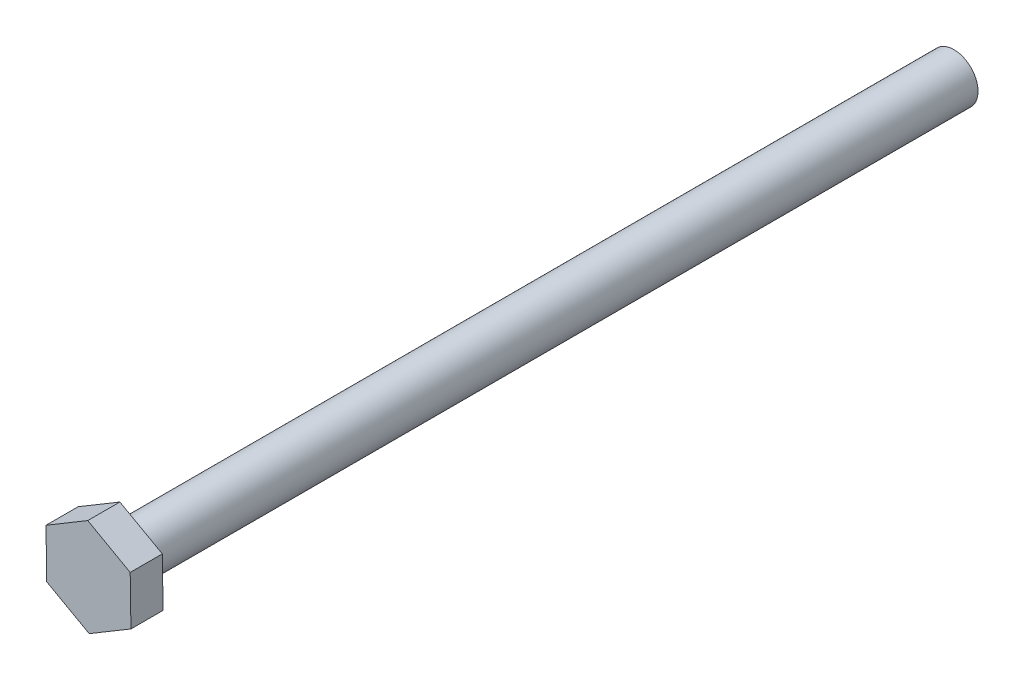
ISO-10303-21;
HEADER;
FILE_DESCRIPTION(('STEP AP214'),'2;1');
FILE_NAME('part.step','',(''),(''),'','','');
FILE_SCHEMA(('AUTOMOTIVE_DESIGN { 1 0 10303 214 1 1 1 1 }'));
ENDSEC;
DATA;
#1=APPLICATION_CONTEXT('core data for automotive mechanical design processes');
#2=APPLICATION_PROTOCOL_DEFINITION('international standard','automotive_design',2000,#1);
#3=PRODUCT_CONTEXT('',#1,'mechanical');
#4=PRODUCT('Part','Part','',(#3));
#5=PRODUCT_RELATED_PRODUCT_CATEGORY('part','',(#4));
#6=PRODUCT_DEFINITION_FORMATION('','',#4);
#7=PRODUCT_DEFINITION_CONTEXT('part definition',#1,'design');
#8=PRODUCT_DEFINITION('design','',#6,#7);
#9=PRODUCT_DEFINITION_SHAPE('','',#8);
#10=(LENGTH_UNIT() NAMED_UNIT(*) SI_UNIT(.MILLI.,.METRE.));
#11=(NAMED_UNIT(*) PLANE_ANGLE_UNIT() SI_UNIT($,.RADIAN.));
#12=(NAMED_UNIT(*) SI_UNIT($,.STERADIAN.) SOLID_ANGLE_UNIT());
#13=UNCERTAINTY_MEASURE_WITH_UNIT(LENGTH_MEASURE(1.E-05),#10,'distance_accuracy_value','');
#14=(GEOMETRIC_REPRESENTATION_CONTEXT(3) GLOBAL_UNCERTAINTY_ASSIGNED_CONTEXT((#13)) GLOBAL_UNIT_ASSIGNED_CONTEXT((#10,
#11,#12)) REPRESENTATION_CONTEXT('',''));
#15=CARTESIAN_POINT('',(0.,0.,0.));
#16=DIRECTION('',(0.,0.,1.));
#17=DIRECTION('',(1.,0.,0.));
#18=AXIS2_PLACEMENT_3D('',#15,#16,#17);
#19=CARTESIAN_POINT('',(5.60345634375282,-3.12471264070627,4.2418));
#20=DIRECTION('',(-0.999888867672191,-0.0149081288303805,0.));
#21=DIRECTION('',(0.0149081288303805,-0.999888867672191,0.));
#22=AXIS2_PLACEMENT_3D('',#19,#20,#21);
#23=PLANE('',#22);
#24=DIRECTION('',(-0.0149081288303805,0.999888867672191,0.));
#25=VECTOR('',#24,1.);
#26=CARTESIAN_POINT('',(5.60345634375282,-3.12471264070627,0.));
#27=LINE('',#26,#25);
#28=CARTESIAN_POINT('',(5.60345634375282,-3.12471264070627,0.));
#29=VERTEX_POINT('',#28);
#30=CARTESIAN_POINT('',(5.5078086982544,3.29037922233388,0.));
#31=VERTEX_POINT('',#30);
#32=EDGE_CURVE('E124',#29,#31,#27,.T.);
#33=ORIENTED_EDGE('',*,*,#32,.T.);
#34=DIRECTION('',(0.,0.,-1.));
#35=VECTOR('',#34,1.);
#36=CARTESIAN_POINT('',(5.5078086982544,3.29037922233388,4.2418));
#37=LINE('',#36,#35);
#38=CARTESIAN_POINT('',(5.5078086982544,3.29037922233388,4.2418));
#39=VERTEX_POINT('',#38);
#40=EDGE_CURVE('E41',#39,#31,#37,.T.);
#41=ORIENTED_EDGE('',*,*,#40,.F.);
#42=DIRECTION('',(-0.0149081288303805,0.999888867672191,0.));
#43=VECTOR('',#42,1.);
#44=CARTESIAN_POINT('',(5.60345634375282,-3.12471264070627,4.2418));
#45=LINE('',#44,#43);
#46=CARTESIAN_POINT('',(5.60345634375282,-3.12471264070627,4.2418));
#47=VERTEX_POINT('',#46);
#48=EDGE_CURVE('E135',#47,#39,#45,.T.);
#49=ORIENTED_EDGE('',*,*,#48,.F.);
#50=DIRECTION('',(0.,0.,-1.));
#51=VECTOR('',#50,1.);
#52=CARTESIAN_POINT('',(5.60345634375282,-3.12471264070627,4.2418));
#53=LINE('',#52,#51);
#54=EDGE_CURVE('E120',#47,#29,#53,.T.);
#55=ORIENTED_EDGE('',*,*,#54,.T.);
#56=EDGE_LOOP('',(#33,#41,#49,#55));
#57=FACE_BOUND('',#56,.T.);
#58=ADVANCED_FACE('F38',(#57),#23,.F.);
#59=CARTESIAN_POINT('',(5.5078086982544,3.29037922233388,4.2418));
#60=DIRECTION('',(-0.487033615546095,-0.873383224780565,0.));
#61=DIRECTION('',(0.873383224780565,-0.487033615546095,0.));
#62=AXIS2_PLACEMENT_3D('',#59,#60,#61);
#63=PLANE('',#62);
#64=DIRECTION('',(-0.873383224780565,0.487033615546095,0.));
#65=VECTOR('',#64,1.);
#66=CARTESIAN_POINT('',(5.5078086982544,3.29037922233388,0.));
#67=LINE('',#66,#65);
#68=CARTESIAN_POINT('',(-0.0956476454984201,6.41509186304015,0.));
#69=VERTEX_POINT('',#68);
#70=EDGE_CURVE('E127',#31,#69,#67,.T.);
#71=ORIENTED_EDGE('',*,*,#70,.T.);
#72=DIRECTION('',(0.,0.,-1.));
#73=VECTOR('',#72,1.);
#74=CARTESIAN_POINT('',(-0.0956476454984201,6.41509186304015,4.2418));
#75=LINE('',#74,#73);
#76=CARTESIAN_POINT('',(-0.0956476454984201,6.41509186304015,4.2418));
#77=VERTEX_POINT('',#76);
#78=EDGE_CURVE('E138',#77,#69,#75,.T.);
#79=ORIENTED_EDGE('',*,*,#78,.F.);
#80=DIRECTION('',(-0.873383224780565,0.487033615546095,0.));
#81=VECTOR('',#80,1.);
#82=CARTESIAN_POINT('',(5.5078086982544,3.29037922233388,4.2418));
#83=LINE('',#82,#81);
#84=EDGE_CURVE('E93',#39,#77,#83,.T.);
#85=ORIENTED_EDGE('',*,*,#84,.F.);
#86=ORIENTED_EDGE('',*,*,#40,.T.);
#87=EDGE_LOOP('',(#71,#79,#85,#86));
#88=FACE_BOUND('',#87,.T.);
#89=ADVANCED_FACE('F143',(#88),#63,.F.);
#90=CARTESIAN_POINT('',(-0.0956476454984201,6.41509186304015,4.2418));
#91=DIRECTION('',(0.512855252126097,-0.858475095950184,0.));
#92=DIRECTION('',(0.858475095950184,0.512855252126097,0.));
#93=AXIS2_PLACEMENT_3D('',#90,#91,#92);
#94=PLANE('',#93);
#95=DIRECTION('',(-0.858475095950184,-0.512855252126097,0.));
#96=VECTOR('',#95,1.);
#97=CARTESIAN_POINT('',(-0.0956476454984201,6.41509186304015,0.));
#98=LINE('',#97,#96);
#99=CARTESIAN_POINT('',(-5.60345634375282,3.12471264070627,0.));
#100=VERTEX_POINT('',#99);
#101=EDGE_CURVE('E130',#69,#100,#98,.T.);
#102=ORIENTED_EDGE('',*,*,#101,.T.);
#103=DIRECTION('',(0.,0.,-1.));
#104=VECTOR('',#103,1.);
#105=CARTESIAN_POINT('',(-5.60345634375282,3.12471264070627,4.2418));
#106=LINE('',#105,#104);
#107=CARTESIAN_POINT('',(-5.60345634375282,3.12471264070627,4.2418));
#108=VERTEX_POINT('',#107);
#109=EDGE_CURVE('E115',#108,#100,#106,.T.);
#110=ORIENTED_EDGE('',*,*,#109,.F.);
#111=DIRECTION('',(-0.858475095950184,-0.512855252126097,0.));
#112=VECTOR('',#111,1.);
#113=CARTESIAN_POINT('',(-0.0956476454984201,6.41509186304015,4.2418));
#114=LINE('',#113,#112);
#115=EDGE_CURVE('E106',#77,#108,#114,.T.);
#116=ORIENTED_EDGE('',*,*,#115,.F.);
#117=ORIENTED_EDGE('',*,*,#78,.T.);
#118=EDGE_LOOP('',(#102,#110,#116,#117));
#119=FACE_BOUND('',#118,.T.);
#120=ADVANCED_FACE('F149',(#119),#94,.F.);
#121=CARTESIAN_POINT('',(-5.60345634375282,3.12471264070627,4.2418));
#122=DIRECTION('',(0.999888867672191,0.0149081288303805,0.));
#123=DIRECTION('',(-0.0149081288303805,0.999888867672191,0.));
#124=AXIS2_PLACEMENT_3D('',#121,#122,#123);
#125=PLANE('',#124);
#126=DIRECTION('',(0.0149081288303805,-0.999888867672191,0.));
#127=VECTOR('',#126,1.);
#128=CARTESIAN_POINT('',(-5.60345634375282,3.12471264070627,0.));
#129=LINE('',#128,#127);
#130=CARTESIAN_POINT('',(-5.5078086982544,-3.29037922233388,0.));
#131=VERTEX_POINT('',#130);
#132=EDGE_CURVE('E114',#100,#131,#129,.T.);
#133=ORIENTED_EDGE('',*,*,#132,.T.);
#134=DIRECTION('',(0.,0.,-1.));
#135=VECTOR('',#134,1.);
#136=CARTESIAN_POINT('',(-5.5078086982544,-3.29037922233388,4.2418));
#137=LINE('',#136,#135);
#138=CARTESIAN_POINT('',(-5.5078086982544,-3.29037922233388,4.2418));
#139=VERTEX_POINT('',#138);
#140=EDGE_CURVE('E111',#139,#131,#137,.T.);
#141=ORIENTED_EDGE('',*,*,#140,.F.);
#142=DIRECTION('',(0.0149081288303805,-0.999888867672191,0.));
#143=VECTOR('',#142,1.);
#144=CARTESIAN_POINT('',(-5.60345634375282,3.12471264070627,4.2418));
#145=LINE('',#144,#143);
#146=EDGE_CURVE('E100',#108,#139,#145,.T.);
#147=ORIENTED_EDGE('',*,*,#146,.F.);
#148=ORIENTED_EDGE('',*,*,#109,.T.);
#149=EDGE_LOOP('',(#133,#141,#147,#148));
#150=FACE_BOUND('',#149,.T.);
#151=ADVANCED_FACE('F112',(#150),#125,.F.);
#152=CARTESIAN_POINT('',(-5.5078086982544,-3.29037922233388,4.2418));
#153=DIRECTION('',(0.487033615546095,0.873383224780565,0.));
#154=DIRECTION('',(-0.873383224780565,0.487033615546095,0.));
#155=AXIS2_PLACEMENT_3D('',#152,#153,#154);
#156=PLANE('',#155);
#157=DIRECTION('',(0.873383224780565,-0.487033615546095,0.));
#158=VECTOR('',#157,1.);
#159=CARTESIAN_POINT('',(-5.5078086982544,-3.29037922233388,0.));
#160=LINE('',#159,#158);
#161=CARTESIAN_POINT('',(0.0956476454984216,-6.41509186304015,0.));
#162=VERTEX_POINT('',#161);
#163=EDGE_CURVE('E78',#131,#162,#160,.T.);
#164=ORIENTED_EDGE('',*,*,#163,.T.);
#165=DIRECTION('',(0.,0.,-1.));
#166=VECTOR('',#165,1.);
#167=CARTESIAN_POINT('',(0.0956476454984216,-6.41509186304015,4.2418));
#168=LINE('',#167,#166);
#169=CARTESIAN_POINT('',(0.0956476454984216,-6.41509186304015,4.2418));
#170=VERTEX_POINT('',#169);
#171=EDGE_CURVE('E116',#170,#162,#168,.T.);
#172=ORIENTED_EDGE('',*,*,#171,.F.);
#173=DIRECTION('',(0.873383224780565,-0.487033615546095,0.));
#174=VECTOR('',#173,1.);
#175=CARTESIAN_POINT('',(-5.5078086982544,-3.29037922233388,4.2418));
#176=LINE('',#175,#174);
#177=EDGE_CURVE('E104',#139,#170,#176,.T.);
#178=ORIENTED_EDGE('',*,*,#177,.F.);
#179=ORIENTED_EDGE('',*,*,#140,.T.);
#180=EDGE_LOOP('',(#164,#172,#178,#179));
#181=FACE_BOUND('',#180,.T.);
#182=ADVANCED_FACE('F118',(#181),#156,.F.);
#183=CARTESIAN_POINT('',(0.0956476454984216,-6.41509186304015,4.2418));
#184=DIRECTION('',(-0.512855252126096,0.858475095950184,0.));
#185=DIRECTION('',(-0.858475095950184,-0.512855252126097,0.));
#186=AXIS2_PLACEMENT_3D('',#183,#184,#185);
#187=PLANE('',#186);
#188=DIRECTION('',(0.858475095950184,0.512855252126096,0.));
#189=VECTOR('',#188,1.);
#190=CARTESIAN_POINT('',(0.0956476454984216,-6.41509186304015,0.));
#191=LINE('',#190,#189);
#192=EDGE_CURVE('E84',#162,#29,#191,.T.);
#193=ORIENTED_EDGE('',*,*,#192,.T.);
#194=ORIENTED_EDGE('',*,*,#54,.F.);
#195=DIRECTION('',(0.858475095950184,0.512855252126096,0.));
#196=VECTOR('',#195,1.);
#197=CARTESIAN_POINT('',(0.0956476454984216,-6.41509186304015,4.2418));
#198=LINE('',#197,#196);
#199=EDGE_CURVE('E55',#170,#47,#198,.T.);
#200=ORIENTED_EDGE('',*,*,#199,.F.);
#201=ORIENTED_EDGE('',*,*,#171,.T.);
#202=EDGE_LOOP('',(#193,#194,#200,#201));
#203=FACE_BOUND('',#202,.T.);
#204=ADVANCED_FACE('F169',(#203),#187,.F.);
#205=CARTESIAN_POINT('',(0.,0.,4.2418));
#206=DIRECTION('',(0.,0.,1.));
#207=DIRECTION('',(1.,0.,0.));
#208=AXIS2_PLACEMENT_3D('',#205,#206,#207);
#209=PLANE('',#208);
#210=ORIENTED_EDGE('',*,*,#48,.T.);
#211=ORIENTED_EDGE('',*,*,#84,.T.);
#212=ORIENTED_EDGE('',*,*,#115,.T.);
#213=ORIENTED_EDGE('',*,*,#146,.T.);
#214=ORIENTED_EDGE('',*,*,#177,.T.);
#215=ORIENTED_EDGE('',*,*,#199,.T.);
#216=EDGE_LOOP('',(#210,#211,#212,#213,#214,#215));
#217=FACE_BOUND('',#216,.T.);
#218=ADVANCED_FACE('F102',(#217),#209,.T.);
#219=CARTESIAN_POINT('',(0.,0.,0.));
#220=DIRECTION('',(0.,0.,1.));
#221=DIRECTION('',(1.,0.,0.));
#222=AXIS2_PLACEMENT_3D('',#219,#220,#221);
#223=PLANE('',#222);
#224=CARTESIAN_POINT('',(0.,0.,0.));
#225=DIRECTION('',(0.,0.,-1.));
#226=DIRECTION('',(-1.,0.,0.));
#227=AXIS2_PLACEMENT_3D('',#224,#225,#226);
#228=CIRCLE('',#227,3.175);
#229=CARTESIAN_POINT('',(-3.175,0.,0.));
#230=VERTEX_POINT('',#229);
#231=EDGE_CURVE('E11',#230,#230,#228,.T.);
#232=ORIENTED_EDGE('',*,*,#231,.F.);
#233=EDGE_LOOP('',(#232));
#234=FACE_BOUND('',#233,.T.);
#235=ORIENTED_EDGE('',*,*,#32,.F.);
#236=ORIENTED_EDGE('',*,*,#192,.F.);
#237=ORIENTED_EDGE('',*,*,#163,.F.);
#238=ORIENTED_EDGE('',*,*,#132,.F.);
#239=ORIENTED_EDGE('',*,*,#101,.F.);
#240=ORIENTED_EDGE('',*,*,#70,.F.);
#241=EDGE_LOOP('',(#235,#236,#237,#238,#239,#240));
#242=FACE_BOUND('',#241,.T.);
#243=ADVANCED_FACE('F148',(#234,#242),#223,.F.);
#244=CARTESIAN_POINT('',(0.,0.,-109.982));
#245=DIRECTION('',(0.,0.,1.));
#246=DIRECTION('',(1.,0.,0.));
#247=AXIS2_PLACEMENT_3D('',#244,#245,#246);
#248=CYLINDRICAL_SURFACE('',#247,3.175);
#249=CARTESIAN_POINT('',(0.,0.,-109.982));
#250=DIRECTION('',(0.,0.,-1.));
#251=DIRECTION('',(-1.,0.,0.));
#252=AXIS2_PLACEMENT_3D('',#249,#250,#251);
#253=CIRCLE('',#252,3.175);
#254=CARTESIAN_POINT('',(-3.175,0.,-109.982));
#255=VERTEX_POINT('',#254);
#256=EDGE_CURVE('E128',#255,#255,#253,.T.);
#257=ORIENTED_EDGE('',*,*,#256,.F.);
#258=EDGE_LOOP('',(#257));
#259=FACE_BOUND('',#258,.T.);
#260=ORIENTED_EDGE('',*,*,#231,.T.);
#261=EDGE_LOOP('',(#260));
#262=FACE_BOUND('',#261,.T.);
#263=ADVANCED_FACE('F158',(#259,#262),#248,.T.);
#264=CARTESIAN_POINT('',(0.,0.,-109.982));
#265=DIRECTION('',(0.,0.,-1.));
#266=DIRECTION('',(-1.,0.,0.));
#267=AXIS2_PLACEMENT_3D('',#264,#265,#266);
#268=PLANE('',#267);
#269=ORIENTED_EDGE('',*,*,#256,.T.);
#270=EDGE_LOOP('',(#269));
#271=FACE_BOUND('',#270,.T.);
#272=ADVANCED_FACE('F156',(#271),#268,.T.);
#273=CLOSED_SHELL('',(#58,#89,#120,#151,#182,#204,#218,#243,#263,#272));
#274=MANIFOLD_SOLID_BREP('B2',#273);
#275=ADVANCED_BREP_SHAPE_REPRESENTATION('',(#18,#274),#14);
#276=SHAPE_DEFINITION_REPRESENTATION(#9,#275);
ENDSEC;
END-ISO-10303-21;
